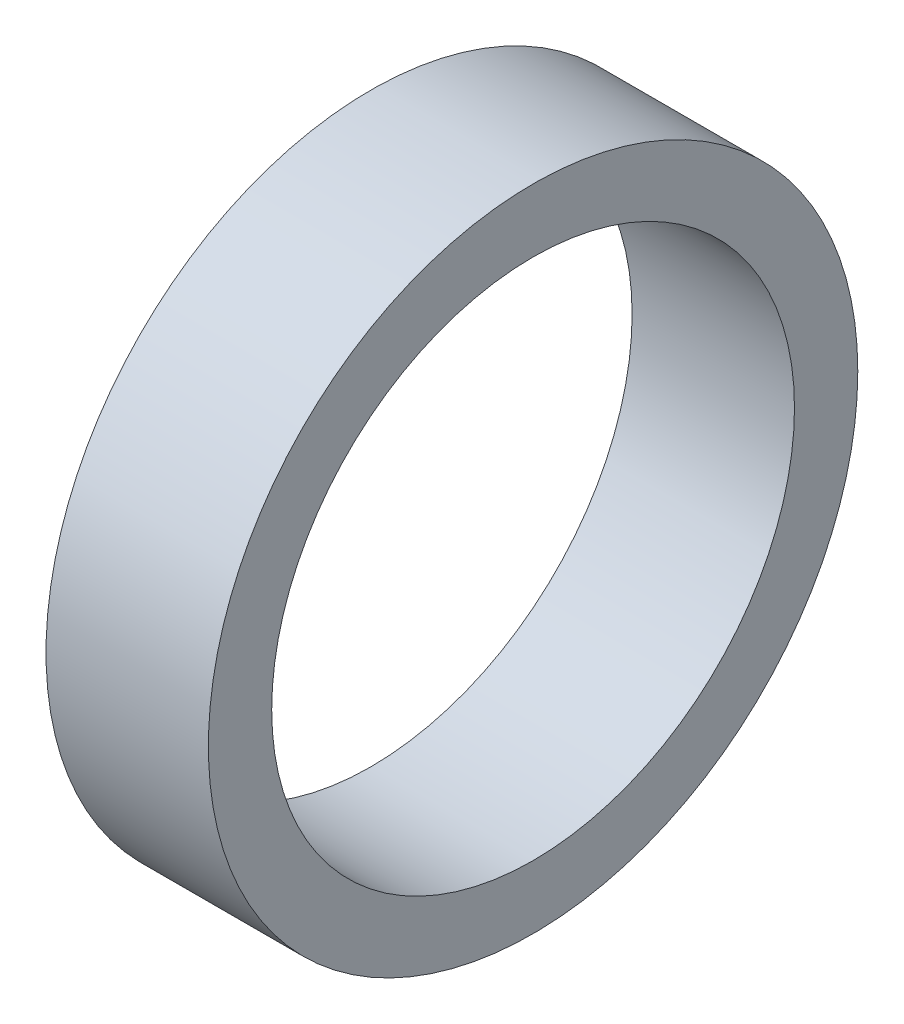
ISO-10303-21;
HEADER;
FILE_DESCRIPTION(('STEP AP214'),'2;1');
FILE_NAME('part.step','',(''),(''),'','','');
FILE_SCHEMA(('AUTOMOTIVE_DESIGN { 1 0 10303 214 1 1 1 1 }'));
ENDSEC;
DATA;
#1=APPLICATION_CONTEXT('core data for automotive mechanical design processes');
#2=APPLICATION_PROTOCOL_DEFINITION('international standard','automotive_design',2000,#1);
#3=PRODUCT_CONTEXT('',#1,'mechanical');
#4=PRODUCT('Part','Part','',(#3));
#5=PRODUCT_RELATED_PRODUCT_CATEGORY('part','',(#4));
#6=PRODUCT_DEFINITION_FORMATION('','',#4);
#7=PRODUCT_DEFINITION_CONTEXT('part definition',#1,'design');
#8=PRODUCT_DEFINITION('design','',#6,#7);
#9=PRODUCT_DEFINITION_SHAPE('','',#8);
#10=(LENGTH_UNIT() NAMED_UNIT(*) SI_UNIT(.MILLI.,.METRE.));
#11=(NAMED_UNIT(*) PLANE_ANGLE_UNIT() SI_UNIT($,.RADIAN.));
#12=(NAMED_UNIT(*) SI_UNIT($,.STERADIAN.) SOLID_ANGLE_UNIT());
#13=UNCERTAINTY_MEASURE_WITH_UNIT(LENGTH_MEASURE(1.E-05),#10,'distance_accuracy_value','');
#14=(GEOMETRIC_REPRESENTATION_CONTEXT(3) GLOBAL_UNCERTAINTY_ASSIGNED_CONTEXT((#13)) GLOBAL_UNIT_ASSIGNED_CONTEXT((#10,
#11,#12)) REPRESENTATION_CONTEXT('',''));
#15=CARTESIAN_POINT('',(0.,0.,0.));
#16=DIRECTION('',(0.,0.,1.));
#17=DIRECTION('',(1.,0.,0.));
#18=AXIS2_PLACEMENT_3D('',#15,#16,#17);
#19=CARTESIAN_POINT('',(2.5,0.,0.));
#20=DIRECTION('',(1.,0.,0.));
#21=DIRECTION('',(0.,0.,-1.));
#22=AXIS2_PLACEMENT_3D('',#19,#20,#21);
#23=PLANE('',#22);
#24=CARTESIAN_POINT('',(2.5,0.,0.));
#25=DIRECTION('',(1.,0.,0.));
#26=DIRECTION('',(0.,0.,-1.));
#27=AXIS2_PLACEMENT_3D('',#24,#25,#26);
#28=CIRCLE('',#27,5.);
#29=CARTESIAN_POINT('',(2.5,0.,-5.));
#30=VERTEX_POINT('',#29);
#31=EDGE_CURVE('E10',#30,#30,#28,.T.);
#32=ORIENTED_EDGE('',*,*,#31,.T.);
#33=EDGE_LOOP('',(#32));
#34=FACE_BOUND('',#33,.T.);
#35=CARTESIAN_POINT('',(2.5,0.,0.));
#36=DIRECTION('',(1.,0.,0.));
#37=DIRECTION('',(0.,0.,-1.));
#38=AXIS2_PLACEMENT_3D('',#35,#36,#37);
#39=CIRCLE('',#38,4.025);
#40=CARTESIAN_POINT('',(2.5,0.,-4.025));
#41=VERTEX_POINT('',#40);
#42=EDGE_CURVE('E56',#41,#41,#39,.T.);
#43=ORIENTED_EDGE('',*,*,#42,.F.);
#44=EDGE_LOOP('',(#43));
#45=FACE_BOUND('',#44,.T.);
#46=ADVANCED_FACE('F43',(#34,#45),#23,.T.);
#47=CARTESIAN_POINT('',(0.,0.,0.));
#48=DIRECTION('',(1.,0.,0.));
#49=DIRECTION('',(0.,0.,-1.));
#50=AXIS2_PLACEMENT_3D('',#47,#48,#49);
#51=PLANE('',#50);
#52=CARTESIAN_POINT('',(0.,0.,0.));
#53=DIRECTION('',(1.,0.,0.));
#54=DIRECTION('',(0.,0.,-1.));
#55=AXIS2_PLACEMENT_3D('',#52,#53,#54);
#56=CIRCLE('',#55,5.);
#57=CARTESIAN_POINT('',(0.,0.,-5.));
#58=VERTEX_POINT('',#57);
#59=EDGE_CURVE('E47',#58,#58,#56,.T.);
#60=ORIENTED_EDGE('',*,*,#59,.F.);
#61=EDGE_LOOP('',(#60));
#62=FACE_BOUND('',#61,.T.);
#63=CARTESIAN_POINT('',(0.,0.,0.));
#64=DIRECTION('',(1.,0.,0.));
#65=DIRECTION('',(0.,0.,-1.));
#66=AXIS2_PLACEMENT_3D('',#63,#64,#65);
#67=CIRCLE('',#66,4.025);
#68=CARTESIAN_POINT('',(0.,0.,-4.025));
#69=VERTEX_POINT('',#68);
#70=EDGE_CURVE('E58',#69,#69,#67,.T.);
#71=ORIENTED_EDGE('',*,*,#70,.T.);
#72=EDGE_LOOP('',(#71));
#73=FACE_BOUND('',#72,.T.);
#74=ADVANCED_FACE('F70',(#62,#73),#51,.F.);
#75=CARTESIAN_POINT('',(2.5,0.,0.));
#76=DIRECTION('',(-1.,0.,0.));
#77=DIRECTION('',(0.,0.,1.));
#78=AXIS2_PLACEMENT_3D('',#75,#76,#77);
#79=CYLINDRICAL_SURFACE('',#78,5.);
#80=ORIENTED_EDGE('',*,*,#31,.F.);
#81=EDGE_LOOP('',(#80));
#82=FACE_BOUND('',#81,.T.);
#83=ORIENTED_EDGE('',*,*,#59,.T.);
#84=EDGE_LOOP('',(#83));
#85=FACE_BOUND('',#84,.T.);
#86=ADVANCED_FACE('F45',(#82,#85),#79,.T.);
#87=CARTESIAN_POINT('',(2.5,0.,0.));
#88=DIRECTION('',(-1.,0.,0.));
#89=DIRECTION('',(0.,0.,1.));
#90=AXIS2_PLACEMENT_3D('',#87,#88,#89);
#91=CYLINDRICAL_SURFACE('',#90,4.025);
#92=ORIENTED_EDGE('',*,*,#42,.T.);
#93=EDGE_LOOP('',(#92));
#94=FACE_BOUND('',#93,.T.);
#95=ORIENTED_EDGE('',*,*,#70,.F.);
#96=EDGE_LOOP('',(#95));
#97=FACE_BOUND('',#96,.T.);
#98=ADVANCED_FACE('F66',(#94,#97),#91,.F.);
#99=CLOSED_SHELL('',(#46,#74,#86,#98));
#100=MANIFOLD_SOLID_BREP('B2',#99);
#101=ADVANCED_BREP_SHAPE_REPRESENTATION('',(#18,#100),#14);
#102=SHAPE_DEFINITION_REPRESENTATION(#9,#101);
ENDSEC;
END-ISO-10303-21;
